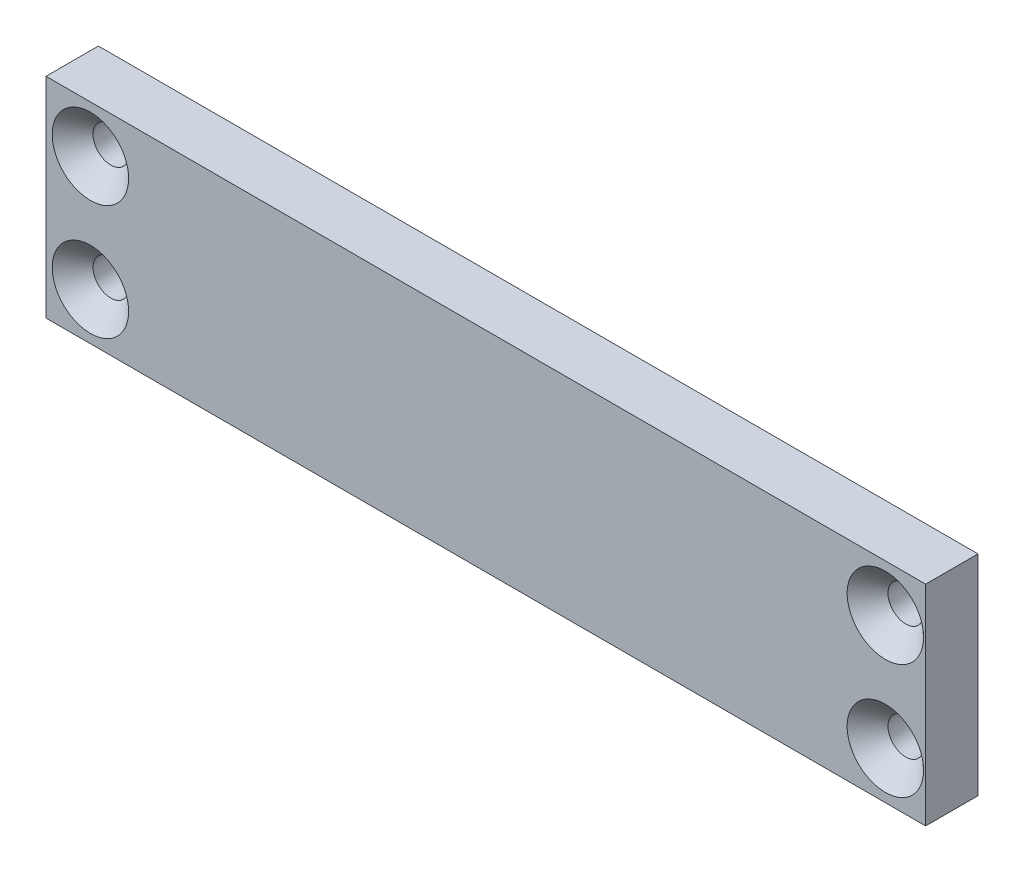
ISO-10303-21;
HEADER;
FILE_DESCRIPTION(('STEP AP214'),'2;1');
FILE_NAME('part.step','',(''),(''),'','','');
FILE_SCHEMA(('AUTOMOTIVE_DESIGN { 1 0 10303 214 1 1 1 1 }'));
ENDSEC;
DATA;
#1=APPLICATION_CONTEXT('core data for automotive mechanical design processes');
#2=APPLICATION_PROTOCOL_DEFINITION('international standard','automotive_design',2000,#1);
#3=PRODUCT_CONTEXT('',#1,'mechanical');
#4=PRODUCT('Part','Part','',(#3));
#5=PRODUCT_RELATED_PRODUCT_CATEGORY('part','',(#4));
#6=PRODUCT_DEFINITION_FORMATION('','',#4);
#7=PRODUCT_DEFINITION_CONTEXT('part definition',#1,'design');
#8=PRODUCT_DEFINITION('design','',#6,#7);
#9=PRODUCT_DEFINITION_SHAPE('','',#8);
#10=(LENGTH_UNIT() NAMED_UNIT(*) SI_UNIT(.MILLI.,.METRE.));
#11=(NAMED_UNIT(*) PLANE_ANGLE_UNIT() SI_UNIT($,.RADIAN.));
#12=(NAMED_UNIT(*) SI_UNIT($,.STERADIAN.) SOLID_ANGLE_UNIT());
#13=UNCERTAINTY_MEASURE_WITH_UNIT(LENGTH_MEASURE(1.E-05),#10,'distance_accuracy_value','');
#14=(GEOMETRIC_REPRESENTATION_CONTEXT(3) GLOBAL_UNCERTAINTY_ASSIGNED_CONTEXT((#13)) GLOBAL_UNIT_ASSIGNED_CONTEXT((#10,
#11,#12)) REPRESENTATION_CONTEXT('',''));
#15=CARTESIAN_POINT('',(0.,0.,0.));
#16=DIRECTION('',(0.,0.,1.));
#17=DIRECTION('',(1.,0.,0.));
#18=AXIS2_PLACEMENT_3D('',#15,#16,#17);
#19=CARTESIAN_POINT('',(-42.,10.,5.));
#20=DIRECTION('',(1.,0.,0.));
#21=DIRECTION('',(0.,1.,0.));
#22=AXIS2_PLACEMENT_3D('',#19,#20,#21);
#23=PLANE('',#22);
#24=DIRECTION('',(0.,-1.,0.));
#25=VECTOR('',#24,1.);
#26=CARTESIAN_POINT('',(-42.,10.,0.));
#27=LINE('',#26,#25);
#28=CARTESIAN_POINT('',(-42.,10.,0.));
#29=VERTEX_POINT('',#28);
#30=CARTESIAN_POINT('',(-42.,-10.,0.));
#31=VERTEX_POINT('',#30);
#32=EDGE_CURVE('E107',#29,#31,#27,.T.);
#33=ORIENTED_EDGE('',*,*,#32,.T.);
#34=DIRECTION('',(0.,0.,-1.));
#35=VECTOR('',#34,1.);
#36=CARTESIAN_POINT('',(-42.,-10.,5.));
#37=LINE('',#36,#35);
#38=CARTESIAN_POINT('',(-42.,-10.,5.));
#39=VERTEX_POINT('',#38);
#40=EDGE_CURVE('E11',#39,#31,#37,.T.);
#41=ORIENTED_EDGE('',*,*,#40,.F.);
#42=DIRECTION('',(0.,-1.,0.));
#43=VECTOR('',#42,1.);
#44=CARTESIAN_POINT('',(-42.,10.,5.));
#45=LINE('',#44,#43);
#46=CARTESIAN_POINT('',(-42.,10.,5.));
#47=VERTEX_POINT('',#46);
#48=EDGE_CURVE('E92',#47,#39,#45,.T.);
#49=ORIENTED_EDGE('',*,*,#48,.F.);
#50=DIRECTION('',(0.,0.,-1.));
#51=VECTOR('',#50,1.);
#52=CARTESIAN_POINT('',(-42.,10.,5.));
#53=LINE('',#52,#51);
#54=EDGE_CURVE('E59',#47,#29,#53,.T.);
#55=ORIENTED_EDGE('',*,*,#54,.T.);
#56=EDGE_LOOP('',(#33,#41,#49,#55));
#57=FACE_BOUND('',#56,.T.);
#58=ADVANCED_FACE('F41',(#57),#23,.F.);
#59=CARTESIAN_POINT('',(-42.,-10.,5.));
#60=DIRECTION('',(0.,1.,0.));
#61=DIRECTION('',(0.,0.,1.));
#62=AXIS2_PLACEMENT_3D('',#59,#60,#61);
#63=PLANE('',#62);
#64=DIRECTION('',(1.,0.,0.));
#65=VECTOR('',#64,1.);
#66=CARTESIAN_POINT('',(-42.,-10.,0.));
#67=LINE('',#66,#65);
#68=CARTESIAN_POINT('',(42.,-10.,0.));
#69=VERTEX_POINT('',#68);
#70=EDGE_CURVE('E97',#31,#69,#67,.T.);
#71=ORIENTED_EDGE('',*,*,#70,.T.);
#72=DIRECTION('',(0.,0.,-1.));
#73=VECTOR('',#72,1.);
#74=CARTESIAN_POINT('',(42.,-10.,5.));
#75=LINE('',#74,#73);
#76=CARTESIAN_POINT('',(42.,-10.,5.));
#77=VERTEX_POINT('',#76);
#78=EDGE_CURVE('E50',#77,#69,#75,.T.);
#79=ORIENTED_EDGE('',*,*,#78,.F.);
#80=DIRECTION('',(1.,0.,0.));
#81=VECTOR('',#80,1.);
#82=CARTESIAN_POINT('',(-42.,-10.,5.));
#83=LINE('',#82,#81);
#84=EDGE_CURVE('E84',#39,#77,#83,.T.);
#85=ORIENTED_EDGE('',*,*,#84,.F.);
#86=ORIENTED_EDGE('',*,*,#40,.T.);
#87=EDGE_LOOP('',(#71,#79,#85,#86));
#88=FACE_BOUND('',#87,.T.);
#89=ADVANCED_FACE('F96',(#88),#63,.F.);
#90=CARTESIAN_POINT('',(42.,10.,5.));
#91=DIRECTION('',(1.,0.,0.));
#92=DIRECTION('',(0.,0.,-1.));
#93=AXIS2_PLACEMENT_3D('',#90,#91,#92);
#94=PLANE('',#93);
#95=DIRECTION('',(0.,-1.,0.));
#96=VECTOR('',#95,1.);
#97=CARTESIAN_POINT('',(42.,10.,0.));
#98=LINE('',#97,#96);
#99=CARTESIAN_POINT('',(42.,10.,0.));
#100=VERTEX_POINT('',#99);
#101=EDGE_CURVE('E111',#100,#69,#98,.T.);
#102=ORIENTED_EDGE('',*,*,#101,.F.);
#103=DIRECTION('',(0.,0.,-1.));
#104=VECTOR('',#103,1.);
#105=CARTESIAN_POINT('',(42.,10.,5.));
#106=LINE('',#105,#104);
#107=CARTESIAN_POINT('',(42.,10.,5.));
#108=VERTEX_POINT('',#107);
#109=EDGE_CURVE('E73',#108,#100,#106,.T.);
#110=ORIENTED_EDGE('',*,*,#109,.F.);
#111=DIRECTION('',(0.,-1.,0.));
#112=VECTOR('',#111,1.);
#113=CARTESIAN_POINT('',(42.,10.,5.));
#114=LINE('',#113,#112);
#115=EDGE_CURVE('E91',#108,#77,#114,.T.);
#116=ORIENTED_EDGE('',*,*,#115,.T.);
#117=ORIENTED_EDGE('',*,*,#78,.T.);
#118=EDGE_LOOP('',(#102,#110,#116,#117));
#119=FACE_BOUND('',#118,.T.);
#120=ADVANCED_FACE('F101',(#119),#94,.T.);
#121=CARTESIAN_POINT('',(-42.,10.,5.));
#122=DIRECTION('',(0.,1.,0.));
#123=DIRECTION('',(0.,0.,1.));
#124=AXIS2_PLACEMENT_3D('',#121,#122,#123);
#125=PLANE('',#124);
#126=DIRECTION('',(1.,0.,0.));
#127=VECTOR('',#126,1.);
#128=CARTESIAN_POINT('',(-42.,10.,0.));
#129=LINE('',#128,#127);
#130=EDGE_CURVE('E113',#29,#100,#129,.T.);
#131=ORIENTED_EDGE('',*,*,#130,.F.);
#132=ORIENTED_EDGE('',*,*,#54,.F.);
#133=DIRECTION('',(1.,0.,0.));
#134=VECTOR('',#133,1.);
#135=CARTESIAN_POINT('',(-42.,10.,5.));
#136=LINE('',#135,#134);
#137=EDGE_CURVE('E102',#47,#108,#136,.T.);
#138=ORIENTED_EDGE('',*,*,#137,.T.);
#139=ORIENTED_EDGE('',*,*,#109,.T.);
#140=EDGE_LOOP('',(#131,#132,#138,#139));
#141=FACE_BOUND('',#140,.T.);
#142=ADVANCED_FACE('F161',(#141),#125,.T.);
#143=CARTESIAN_POINT('',(0.,0.,5.));
#144=DIRECTION('',(0.,0.,1.));
#145=DIRECTION('',(1.,0.,0.));
#146=AXIS2_PLACEMENT_3D('',#143,#144,#145);
#147=PLANE('',#146);
#148=CARTESIAN_POINT('',(38.1536541240035,5.50000000000002,5.));
#149=DIRECTION('',(0.,0.,1.));
#150=DIRECTION('',(1.,0.,0.));
#151=AXIS2_PLACEMENT_3D('',#148,#149,#150);
#152=CIRCLE('',#151,3.65);
#153=CARTESIAN_POINT('',(41.8036541240035,5.50000000000002,5.));
#154=VERTEX_POINT('',#153);
#155=EDGE_CURVE('E280',#154,#154,#152,.T.);
#156=ORIENTED_EDGE('',*,*,#155,.F.);
#157=EDGE_LOOP('',(#156));
#158=FACE_BOUND('',#157,.T.);
#159=CARTESIAN_POINT('',(38.1536541240035,-5.49999999999997,5.));
#160=DIRECTION('',(0.,0.,1.));
#161=DIRECTION('',(1.,0.,0.));
#162=AXIS2_PLACEMENT_3D('',#159,#160,#161);
#163=CIRCLE('',#162,3.65);
#164=CARTESIAN_POINT('',(41.8036541240035,-5.49999999999997,5.));
#165=VERTEX_POINT('',#164);
#166=EDGE_CURVE('E134',#165,#165,#163,.T.);
#167=ORIENTED_EDGE('',*,*,#166,.F.);
#168=EDGE_LOOP('',(#167));
#169=FACE_BOUND('',#168,.T.);
#170=CARTESIAN_POINT('',(-37.7584202742466,5.5,5.));
#171=DIRECTION('',(0.,0.,1.));
#172=DIRECTION('',(1.,0.,0.));
#173=AXIS2_PLACEMENT_3D('',#170,#171,#172);
#174=CIRCLE('',#173,3.65);
#175=CARTESIAN_POINT('',(-34.1084202742466,5.5,5.));
#176=VERTEX_POINT('',#175);
#177=EDGE_CURVE('E127',#176,#176,#174,.T.);
#178=ORIENTED_EDGE('',*,*,#177,.F.);
#179=EDGE_LOOP('',(#178));
#180=FACE_BOUND('',#179,.T.);
#181=CARTESIAN_POINT('',(-37.7584202742466,-5.49999999999999,5.));
#182=DIRECTION('',(0.,0.,1.));
#183=DIRECTION('',(1.,0.,0.));
#184=AXIS2_PLACEMENT_3D('',#181,#182,#183);
#185=CIRCLE('',#184,3.65);
#186=CARTESIAN_POINT('',(-34.1084202742466,-5.49999999999999,5.));
#187=VERTEX_POINT('',#186);
#188=EDGE_CURVE('E123',#187,#187,#185,.T.);
#189=ORIENTED_EDGE('',*,*,#188,.F.);
#190=EDGE_LOOP('',(#189));
#191=FACE_BOUND('',#190,.T.);
#192=ORIENTED_EDGE('',*,*,#48,.T.);
#193=ORIENTED_EDGE('',*,*,#84,.T.);
#194=ORIENTED_EDGE('',*,*,#115,.F.);
#195=ORIENTED_EDGE('',*,*,#137,.F.);
#196=EDGE_LOOP('',(#192,#193,#194,#195));
#197=FACE_BOUND('',#196,.T.);
#198=ADVANCED_FACE('F88',(#158,#169,#180,#191,#197),#147,.T.);
#199=CARTESIAN_POINT('',(0.,0.,0.));
#200=DIRECTION('',(0.,0.,1.));
#201=DIRECTION('',(1.,0.,0.));
#202=AXIS2_PLACEMENT_3D('',#199,#200,#201);
#203=PLANE('',#202);
#204=CARTESIAN_POINT('',(38.1536541240035,5.50000000000002,0.));
#205=DIRECTION('',(0.,0.,1.));
#206=DIRECTION('',(1.,0.,0.));
#207=AXIS2_PLACEMENT_3D('',#204,#205,#206);
#208=CIRCLE('',#207,1.69999999999999);
#209=CARTESIAN_POINT('',(39.8536541240035,5.50000000000002,0.));
#210=VERTEX_POINT('',#209);
#211=EDGE_CURVE('E44',#210,#210,#208,.T.);
#212=ORIENTED_EDGE('',*,*,#211,.T.);
#213=EDGE_LOOP('',(#212));
#214=FACE_BOUND('',#213,.T.);
#215=CARTESIAN_POINT('',(38.1536541240035,-5.49999999999997,0.));
#216=DIRECTION('',(0.,0.,1.));
#217=DIRECTION('',(1.,0.,0.));
#218=AXIS2_PLACEMENT_3D('',#215,#216,#217);
#219=CIRCLE('',#218,1.69999999999999);
#220=CARTESIAN_POINT('',(39.8536541240035,-5.49999999999997,0.));
#221=VERTEX_POINT('',#220);
#222=EDGE_CURVE('E125',#221,#221,#219,.T.);
#223=ORIENTED_EDGE('',*,*,#222,.T.);
#224=EDGE_LOOP('',(#223));
#225=FACE_BOUND('',#224,.T.);
#226=CARTESIAN_POINT('',(-37.7584202742466,5.5,0.));
#227=DIRECTION('',(0.,0.,1.));
#228=DIRECTION('',(1.,0.,0.));
#229=AXIS2_PLACEMENT_3D('',#226,#227,#228);
#230=CIRCLE('',#229,1.69999999999999);
#231=CARTESIAN_POINT('',(-36.0584202742466,5.5,0.));
#232=VERTEX_POINT('',#231);
#233=EDGE_CURVE('E121',#232,#232,#230,.T.);
#234=ORIENTED_EDGE('',*,*,#233,.T.);
#235=EDGE_LOOP('',(#234));
#236=FACE_BOUND('',#235,.T.);
#237=CARTESIAN_POINT('',(-37.7584202742466,-5.49999999999999,0.));
#238=DIRECTION('',(0.,0.,1.));
#239=DIRECTION('',(1.,0.,0.));
#240=AXIS2_PLACEMENT_3D('',#237,#238,#239);
#241=CIRCLE('',#240,1.69999999999999);
#242=CARTESIAN_POINT('',(-36.0584202742466,-5.49999999999999,0.));
#243=VERTEX_POINT('',#242);
#244=EDGE_CURVE('E109',#243,#243,#241,.T.);
#245=ORIENTED_EDGE('',*,*,#244,.T.);
#246=EDGE_LOOP('',(#245));
#247=FACE_BOUND('',#246,.T.);
#248=ORIENTED_EDGE('',*,*,#32,.F.);
#249=ORIENTED_EDGE('',*,*,#130,.T.);
#250=ORIENTED_EDGE('',*,*,#101,.T.);
#251=ORIENTED_EDGE('',*,*,#70,.F.);
#252=EDGE_LOOP('',(#248,#249,#250,#251));
#253=FACE_BOUND('',#252,.T.);
#254=ADVANCED_FACE('F160',(#214,#225,#236,#247,#253),#203,.F.);
#255=CARTESIAN_POINT('',(-37.7584202742466,-5.49999999999999,5.));
#256=DIRECTION('',(0.,0.,1.));
#257=DIRECTION('',(1.,0.,0.));
#258=AXIS2_PLACEMENT_3D('',#255,#256,#257);
#259=CYLINDRICAL_SURFACE('',#258,1.69999999999999);
#260=CARTESIAN_POINT('',(-37.7584202742466,-5.49999999999999,3.05));
#261=DIRECTION('',(0.,0.,1.));
#262=DIRECTION('',(1.,0.,0.));
#263=AXIS2_PLACEMENT_3D('',#260,#261,#262);
#264=CIRCLE('',#263,1.7);
#265=CARTESIAN_POINT('',(-36.0584202742466,-5.49999999999999,3.05));
#266=VERTEX_POINT('',#265);
#267=EDGE_CURVE('E120',#266,#266,#264,.T.);
#268=ORIENTED_EDGE('',*,*,#267,.T.);
#269=EDGE_LOOP('',(#268));
#270=FACE_BOUND('',#269,.T.);
#271=ORIENTED_EDGE('',*,*,#244,.F.);
#272=EDGE_LOOP('',(#271));
#273=FACE_BOUND('',#272,.T.);
#274=ADVANCED_FACE('F149',(#270,#273),#259,.F.);
#275=CARTESIAN_POINT('',(-37.7584202742466,-5.49999999999999,5.));
#276=DIRECTION('',(0.,0.,1.));
#277=DIRECTION('',(1.,0.,0.));
#278=AXIS2_PLACEMENT_3D('',#275,#276,#277);
#279=CONICAL_SURFACE('',#278,3.65,0.785398163397448);
#280=ORIENTED_EDGE('',*,*,#267,.F.);
#281=EDGE_LOOP('',(#280));
#282=FACE_BOUND('',#281,.T.);
#283=ORIENTED_EDGE('',*,*,#188,.T.);
#284=EDGE_LOOP('',(#283));
#285=FACE_BOUND('',#284,.T.);
#286=ADVANCED_FACE('F152',(#282,#285),#279,.F.);
#287=CARTESIAN_POINT('',(-37.7584202742466,5.5,5.));
#288=DIRECTION('',(0.,0.,1.));
#289=DIRECTION('',(1.,0.,0.));
#290=AXIS2_PLACEMENT_3D('',#287,#288,#289);
#291=CYLINDRICAL_SURFACE('',#290,1.69999999999999);
#292=CARTESIAN_POINT('',(-37.7584202742466,5.5,3.05));
#293=DIRECTION('',(0.,0.,1.));
#294=DIRECTION('',(1.,0.,0.));
#295=AXIS2_PLACEMENT_3D('',#292,#293,#294);
#296=CIRCLE('',#295,1.7);
#297=CARTESIAN_POINT('',(-36.0584202742466,5.5,3.05));
#298=VERTEX_POINT('',#297);
#299=EDGE_CURVE('E124',#298,#298,#296,.T.);
#300=ORIENTED_EDGE('',*,*,#299,.T.);
#301=EDGE_LOOP('',(#300));
#302=FACE_BOUND('',#301,.T.);
#303=ORIENTED_EDGE('',*,*,#233,.F.);
#304=EDGE_LOOP('',(#303));
#305=FACE_BOUND('',#304,.T.);
#306=ADVANCED_FACE('F155',(#302,#305),#291,.F.);
#307=CARTESIAN_POINT('',(-37.7584202742466,5.5,5.));
#308=DIRECTION('',(0.,0.,1.));
#309=DIRECTION('',(1.,0.,0.));
#310=AXIS2_PLACEMENT_3D('',#307,#308,#309);
#311=CONICAL_SURFACE('',#310,3.65,0.785398163397448);
#312=ORIENTED_EDGE('',*,*,#299,.F.);
#313=EDGE_LOOP('',(#312));
#314=FACE_BOUND('',#313,.T.);
#315=ORIENTED_EDGE('',*,*,#177,.T.);
#316=EDGE_LOOP('',(#315));
#317=FACE_BOUND('',#316,.T.);
#318=ADVANCED_FACE('F223',(#314,#317),#311,.F.);
#319=CARTESIAN_POINT('',(38.1536541240035,-5.49999999999997,5.));
#320=DIRECTION('',(0.,0.,1.));
#321=DIRECTION('',(1.,0.,0.));
#322=AXIS2_PLACEMENT_3D('',#319,#320,#321);
#323=CYLINDRICAL_SURFACE('',#322,1.69999999999999);
#324=CARTESIAN_POINT('',(38.1536541240035,-5.49999999999997,3.05));
#325=DIRECTION('',(0.,0.,1.));
#326=DIRECTION('',(1.,0.,0.));
#327=AXIS2_PLACEMENT_3D('',#324,#325,#326);
#328=CIRCLE('',#327,1.7);
#329=CARTESIAN_POINT('',(39.8536541240035,-5.49999999999997,3.05));
#330=VERTEX_POINT('',#329);
#331=EDGE_CURVE('E128',#330,#330,#328,.T.);
#332=ORIENTED_EDGE('',*,*,#331,.T.);
#333=EDGE_LOOP('',(#332));
#334=FACE_BOUND('',#333,.T.);
#335=ORIENTED_EDGE('',*,*,#222,.F.);
#336=EDGE_LOOP('',(#335));
#337=FACE_BOUND('',#336,.T.);
#338=ADVANCED_FACE('F233',(#334,#337),#323,.F.);
#339=CARTESIAN_POINT('',(38.1536541240035,-5.49999999999997,5.));
#340=DIRECTION('',(0.,0.,1.));
#341=DIRECTION('',(1.,0.,0.));
#342=AXIS2_PLACEMENT_3D('',#339,#340,#341);
#343=CONICAL_SURFACE('',#342,3.65,0.785398163397448);
#344=ORIENTED_EDGE('',*,*,#331,.F.);
#345=EDGE_LOOP('',(#344));
#346=FACE_BOUND('',#345,.T.);
#347=ORIENTED_EDGE('',*,*,#166,.T.);
#348=EDGE_LOOP('',(#347));
#349=FACE_BOUND('',#348,.T.);
#350=ADVANCED_FACE('F243',(#346,#349),#343,.F.);
#351=CARTESIAN_POINT('',(38.1536541240035,5.50000000000002,5.));
#352=DIRECTION('',(0.,0.,1.));
#353=DIRECTION('',(1.,0.,0.));
#354=AXIS2_PLACEMENT_3D('',#351,#352,#353);
#355=CYLINDRICAL_SURFACE('',#354,1.69999999999999);
#356=CARTESIAN_POINT('',(38.1536541240035,5.50000000000002,3.05));
#357=DIRECTION('',(0.,0.,1.));
#358=DIRECTION('',(1.,0.,0.));
#359=AXIS2_PLACEMENT_3D('',#356,#357,#358);
#360=CIRCLE('',#359,1.7);
#361=CARTESIAN_POINT('',(39.8536541240035,5.50000000000002,3.05));
#362=VERTEX_POINT('',#361);
#363=EDGE_CURVE('E278',#362,#362,#360,.T.);
#364=ORIENTED_EDGE('',*,*,#363,.T.);
#365=EDGE_LOOP('',(#364));
#366=FACE_BOUND('',#365,.T.);
#367=ORIENTED_EDGE('',*,*,#211,.F.);
#368=EDGE_LOOP('',(#367));
#369=FACE_BOUND('',#368,.T.);
#370=ADVANCED_FACE('F252',(#366,#369),#355,.F.);
#371=CARTESIAN_POINT('',(38.1536541240035,5.50000000000002,5.));
#372=DIRECTION('',(0.,0.,1.));
#373=DIRECTION('',(1.,0.,0.));
#374=AXIS2_PLACEMENT_3D('',#371,#372,#373);
#375=CONICAL_SURFACE('',#374,3.65,0.785398163397448);
#376=ORIENTED_EDGE('',*,*,#363,.F.);
#377=EDGE_LOOP('',(#376));
#378=FACE_BOUND('',#377,.T.);
#379=ORIENTED_EDGE('',*,*,#155,.T.);
#380=EDGE_LOOP('',(#379));
#381=FACE_BOUND('',#380,.T.);
#382=ADVANCED_FACE('F262',(#378,#381),#375,.F.);
#383=CLOSED_SHELL('',(#58,#89,#120,#142,#198,#254,#274,#286,#306,#318,#338,#350,#370,#382));
#384=MANIFOLD_SOLID_BREP('B2',#383);
#385=ADVANCED_BREP_SHAPE_REPRESENTATION('',(#18,#384),#14);
#386=SHAPE_DEFINITION_REPRESENTATION(#9,#385);
ENDSEC;
END-ISO-10303-21;
